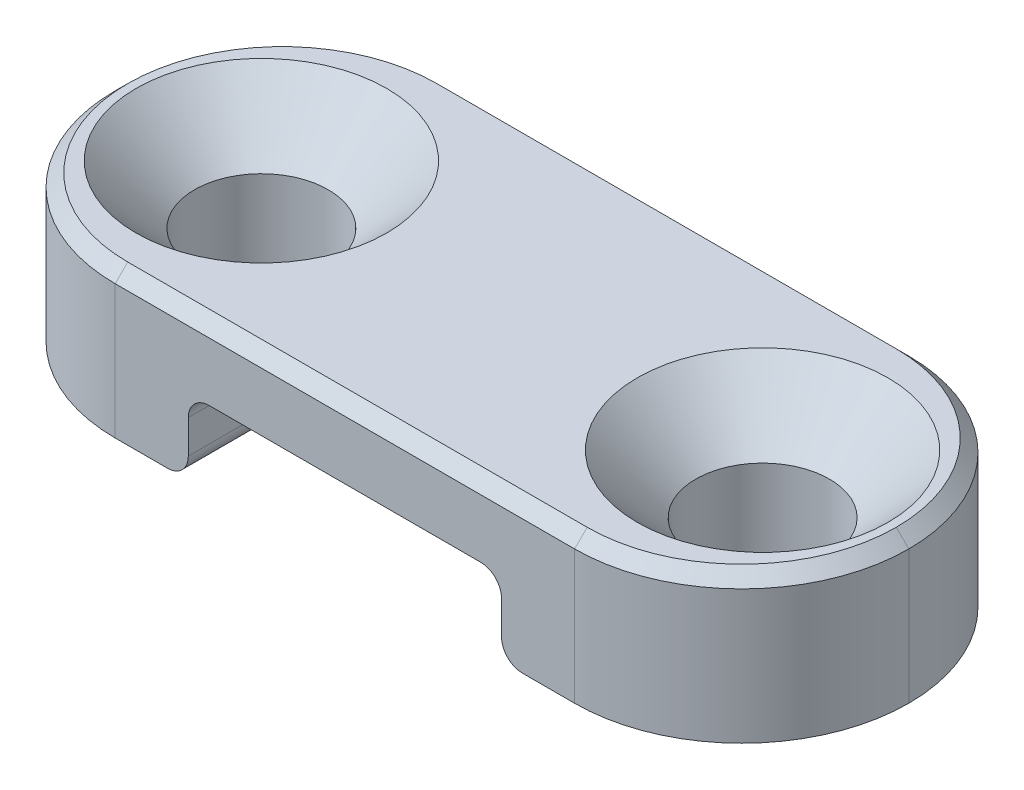
ISO-10303-21;
HEADER;
FILE_DESCRIPTION(('STEP AP214'),'2;1');
FILE_NAME('part.step','',(''),(''),'','','');
FILE_SCHEMA(('AUTOMOTIVE_DESIGN { 1 0 10303 214 1 1 1 1 }'));
ENDSEC;
DATA;
#1=APPLICATION_CONTEXT('core data for automotive mechanical design processes');
#2=APPLICATION_PROTOCOL_DEFINITION('international standard','automotive_design',2000,#1);
#3=PRODUCT_CONTEXT('',#1,'mechanical');
#4=PRODUCT('Part','Part','',(#3));
#5=PRODUCT_RELATED_PRODUCT_CATEGORY('part','',(#4));
#6=PRODUCT_DEFINITION_FORMATION('','',#4);
#7=PRODUCT_DEFINITION_CONTEXT('part definition',#1,'design');
#8=PRODUCT_DEFINITION('design','',#6,#7);
#9=PRODUCT_DEFINITION_SHAPE('','',#8);
#10=(LENGTH_UNIT() NAMED_UNIT(*) SI_UNIT(.MILLI.,.METRE.));
#11=(NAMED_UNIT(*) PLANE_ANGLE_UNIT() SI_UNIT($,.RADIAN.));
#12=(NAMED_UNIT(*) SI_UNIT($,.STERADIAN.) SOLID_ANGLE_UNIT());
#13=UNCERTAINTY_MEASURE_WITH_UNIT(LENGTH_MEASURE(1.E-05),#10,'distance_accuracy_value','');
#14=(GEOMETRIC_REPRESENTATION_CONTEXT(3) GLOBAL_UNCERTAINTY_ASSIGNED_CONTEXT((#13)) GLOBAL_UNIT_ASSIGNED_CONTEXT((#10,
#11,#12)) REPRESENTATION_CONTEXT('',''));
#15=CARTESIAN_POINT('',(0.,0.,0.));
#16=DIRECTION('',(0.,0.,1.));
#17=DIRECTION('',(1.,0.,0.));
#18=AXIS2_PLACEMENT_3D('',#15,#16,#17);
#19=CARTESIAN_POINT('',(0.,-1.75,0.));
#20=DIRECTION('',(0.,-1.,0.));
#21=DIRECTION('',(0.,0.,-1.));
#22=AXIS2_PLACEMENT_3D('',#19,#20,#21);
#23=PLANE('',#22);
#24=CARTESIAN_POINT('',(6.,-1.75,0.));
#25=DIRECTION('',(0.,1.,0.));
#26=DIRECTION('',(0.,0.,1.));
#27=AXIS2_PLACEMENT_3D('',#24,#25,#26);
#28=CIRCLE('',#27,1.6);
#29=CARTESIAN_POINT('',(6.,-1.75,1.6));
#30=VERTEX_POINT('',#29);
#31=EDGE_CURVE('E389',#30,#30,#28,.T.);
#32=ORIENTED_EDGE('',*,*,#31,.T.);
#33=EDGE_LOOP('',(#32));
#34=FACE_BOUND('',#33,.T.);
#35=DIRECTION('',(1.,0.,0.));
#36=VECTOR('',#35,1.);
#37=CARTESIAN_POINT('',(-9.5,-1.75,4.));
#38=LINE('',#37,#36);
#39=CARTESIAN_POINT('',(4.25,-1.75,4.));
#40=VERTEX_POINT('',#39);
#41=CARTESIAN_POINT('',(5.5,-1.75,4.));
#42=VERTEX_POINT('',#41);
#43=EDGE_CURVE('E186',#40,#42,#38,.T.);
#44=ORIENTED_EDGE('',*,*,#43,.F.);
#45=DIRECTION('',(0.,0.,1.));
#46=VECTOR('',#45,1.);
#47=CARTESIAN_POINT('',(4.25,-1.75,-4.));
#48=LINE('',#47,#46);
#49=CARTESIAN_POINT('',(4.25,-1.75,-4.));
#50=VERTEX_POINT('',#49);
#51=EDGE_CURVE('E184',#40,#50,#48,.F.);
#52=ORIENTED_EDGE('',*,*,#51,.T.);
#53=DIRECTION('',(-1.,0.,0.));
#54=VECTOR('',#53,1.);
#55=CARTESIAN_POINT('',(-9.5,-1.75,-4.));
#56=LINE('',#55,#54);
#57=CARTESIAN_POINT('',(5.5,-1.75,-4.));
#58=VERTEX_POINT('',#57);
#59=EDGE_CURVE('E170',#58,#50,#56,.T.);
#60=ORIENTED_EDGE('',*,*,#59,.F.);
#61=CARTESIAN_POINT('',(5.5,-1.75,0.));
#62=DIRECTION('',(0.,-1.,0.));
#63=DIRECTION('',(0.,0.,-1.));
#64=AXIS2_PLACEMENT_3D('',#61,#62,#63);
#65=CIRCLE('',#64,4.);
#66=CARTESIAN_POINT('',(9.5,-1.75,0.));
#67=VERTEX_POINT('',#66);
#68=EDGE_CURVE('E182',#58,#67,#65,.T.);
#69=ORIENTED_EDGE('',*,*,#68,.T.);
#70=CARTESIAN_POINT('',(5.5,-1.75,0.));
#71=DIRECTION('',(0.,-1.,0.));
#72=DIRECTION('',(0.,0.,-1.));
#73=AXIS2_PLACEMENT_3D('',#70,#71,#72);
#74=CIRCLE('',#73,4.);
#75=EDGE_CURVE('E193',#67,#42,#74,.T.);
#76=ORIENTED_EDGE('',*,*,#75,.T.);
#77=EDGE_LOOP('',(#44,#52,#60,#69,#76));
#78=FACE_BOUND('',#77,.T.);
#79=ADVANCED_FACE('F44',(#34,#78),#23,.T.);
#80=CARTESIAN_POINT('',(-9.5,1.75,-4.));
#81=DIRECTION('',(0.,0.,1.));
#82=DIRECTION('',(1.,0.,0.));
#83=AXIS2_PLACEMENT_3D('',#80,#81,#82);
#84=PLANE('',#83);
#85=DIRECTION('',(0.,-1.,0.));
#86=VECTOR('',#85,1.);
#87=CARTESIAN_POINT('',(-5.5,1.75,-4.));
#88=LINE('',#87,#86);
#89=CARTESIAN_POINT('',(-5.5,-1.75,-4.));
#90=VERTEX_POINT('',#89);
#91=CARTESIAN_POINT('',(-5.5,1.45,-4.));
#92=VERTEX_POINT('',#91);
#93=EDGE_CURVE('E176',#90,#92,#88,.F.);
#94=ORIENTED_EDGE('',*,*,#93,.T.);
#95=DIRECTION('',(1.,0.,0.));
#96=VECTOR('',#95,1.);
#97=CARTESIAN_POINT('',(-9.5,1.45,-4.));
#98=LINE('',#97,#96);
#99=CARTESIAN_POINT('',(5.5,1.45,-4.));
#100=VERTEX_POINT('',#99);
#101=EDGE_CURVE('E173',#92,#100,#98,.T.);
#102=ORIENTED_EDGE('',*,*,#101,.T.);
#103=DIRECTION('',(0.,-1.,0.));
#104=VECTOR('',#103,1.);
#105=CARTESIAN_POINT('',(5.5,1.75,-4.));
#106=LINE('',#105,#104);
#107=EDGE_CURVE('E166',#100,#58,#106,.T.);
#108=ORIENTED_EDGE('',*,*,#107,.T.);
#109=ORIENTED_EDGE('',*,*,#59,.T.);
#110=CARTESIAN_POINT('',(4.25,-1.25,-4.));
#111=DIRECTION('',(0.,0.,1.));
#112=DIRECTION('',(1.,0.,0.));
#113=AXIS2_PLACEMENT_3D('',#110,#111,#112);
#114=CIRCLE('',#113,0.5);
#115=CARTESIAN_POINT('',(3.75,-1.25,-4.));
#116=VERTEX_POINT('',#115);
#117=EDGE_CURVE('E242',#50,#116,#114,.F.);
#118=ORIENTED_EDGE('',*,*,#117,.T.);
#119=DIRECTION('',(0.,-1.,0.));
#120=VECTOR('',#119,1.);
#121=CARTESIAN_POINT('',(3.75,-1.75,-4.));
#122=LINE('',#121,#120);
#123=CARTESIAN_POINT('',(3.75,-0.45,-4.));
#124=VERTEX_POINT('',#123);
#125=EDGE_CURVE('E383',#124,#116,#122,.T.);
#126=ORIENTED_EDGE('',*,*,#125,.F.);
#127=CARTESIAN_POINT('',(3.25,-0.45,-4.));
#128=DIRECTION('',(0.,0.,1.));
#129=DIRECTION('',(1.,0.,0.));
#130=AXIS2_PLACEMENT_3D('',#127,#128,#129);
#131=CIRCLE('',#130,0.5);
#132=CARTESIAN_POINT('',(3.25,0.0499999999999999,-4.));
#133=VERTEX_POINT('',#132);
#134=EDGE_CURVE('E267',#124,#133,#131,.T.);
#135=ORIENTED_EDGE('',*,*,#134,.T.);
#136=DIRECTION('',(1.,0.,0.));
#137=VECTOR('',#136,1.);
#138=CARTESIAN_POINT('',(-3.75,0.0499999999999999,-4.));
#139=LINE('',#138,#137);
#140=CARTESIAN_POINT('',(-3.25,0.0499999999999999,-4.));
#141=VERTEX_POINT('',#140);
#142=EDGE_CURVE('E365',#141,#133,#139,.T.);
#143=ORIENTED_EDGE('',*,*,#142,.F.);
#144=CARTESIAN_POINT('',(-3.25,-0.45,-4.));
#145=DIRECTION('',(0.,0.,1.));
#146=DIRECTION('',(1.,0.,0.));
#147=AXIS2_PLACEMENT_3D('',#144,#145,#146);
#148=CIRCLE('',#147,0.5);
#149=CARTESIAN_POINT('',(-3.75,-0.45,-4.));
#150=VERTEX_POINT('',#149);
#151=EDGE_CURVE('E273',#141,#150,#148,.T.);
#152=ORIENTED_EDGE('',*,*,#151,.T.);
#153=DIRECTION('',(0.,1.,0.));
#154=VECTOR('',#153,1.);
#155=CARTESIAN_POINT('',(-3.75,-1.75,-4.));
#156=LINE('',#155,#154);
#157=CARTESIAN_POINT('',(-3.75,-1.25,-4.));
#158=VERTEX_POINT('',#157);
#159=EDGE_CURVE('E370',#158,#150,#156,.T.);
#160=ORIENTED_EDGE('',*,*,#159,.F.);
#161=CARTESIAN_POINT('',(-4.25,-1.25,-4.));
#162=DIRECTION('',(0.,0.,1.));
#163=DIRECTION('',(1.,0.,0.));
#164=AXIS2_PLACEMENT_3D('',#161,#162,#163);
#165=CIRCLE('',#164,0.5);
#166=CARTESIAN_POINT('',(-4.25,-1.75,-4.));
#167=VERTEX_POINT('',#166);
#168=EDGE_CURVE('E245',#158,#167,#165,.F.);
#169=ORIENTED_EDGE('',*,*,#168,.T.);
#170=EDGE_CURVE('E187',#167,#90,#56,.T.);
#171=ORIENTED_EDGE('',*,*,#170,.T.);
#172=EDGE_LOOP('',(#94,#102,#108,#109,#118,#126,#135,#143,#152,#160,#169,#171));
#173=FACE_BOUND('',#172,.T.);
#174=ADVANCED_FACE('F169',(#173),#84,.F.);
#175=CARTESIAN_POINT('',(-9.5,1.75,4.));
#176=DIRECTION('',(0.,0.,-1.));
#177=DIRECTION('',(-1.,0.,0.));
#178=AXIS2_PLACEMENT_3D('',#175,#176,#177);
#179=PLANE('',#178);
#180=DIRECTION('',(0.,-1.,0.));
#181=VECTOR('',#180,1.);
#182=CARTESIAN_POINT('',(5.5,1.75,4.));
#183=LINE('',#182,#181);
#184=CARTESIAN_POINT('',(5.5,1.45,4.));
#185=VERTEX_POINT('',#184);
#186=EDGE_CURVE('E207',#42,#185,#183,.F.);
#187=ORIENTED_EDGE('',*,*,#186,.T.);
#188=DIRECTION('',(-1.,0.,0.));
#189=VECTOR('',#188,1.);
#190=CARTESIAN_POINT('',(-9.5,1.45,4.));
#191=LINE('',#190,#189);
#192=CARTESIAN_POINT('',(-5.5,1.45,4.));
#193=VERTEX_POINT('',#192);
#194=EDGE_CURVE('E304',#185,#193,#191,.T.);
#195=ORIENTED_EDGE('',*,*,#194,.T.);
#196=DIRECTION('',(0.,-1.,0.));
#197=VECTOR('',#196,1.);
#198=CARTESIAN_POINT('',(-5.5,1.75,4.));
#199=LINE('',#198,#197);
#200=CARTESIAN_POINT('',(-5.5,-1.75,4.));
#201=VERTEX_POINT('',#200);
#202=EDGE_CURVE('E199',#193,#201,#199,.T.);
#203=ORIENTED_EDGE('',*,*,#202,.T.);
#204=CARTESIAN_POINT('',(-4.25,-1.75,4.));
#205=VERTEX_POINT('',#204);
#206=EDGE_CURVE('E194',#201,#205,#38,.T.);
#207=ORIENTED_EDGE('',*,*,#206,.T.);
#208=CARTESIAN_POINT('',(-4.25,-1.25,4.));
#209=DIRECTION('',(0.,0.,-1.));
#210=DIRECTION('',(-1.,0.,0.));
#211=AXIS2_PLACEMENT_3D('',#208,#209,#210);
#212=CIRCLE('',#211,0.5);
#213=CARTESIAN_POINT('',(-3.75,-1.25,4.));
#214=VERTEX_POINT('',#213);
#215=EDGE_CURVE('E232',#205,#214,#212,.F.);
#216=ORIENTED_EDGE('',*,*,#215,.T.);
#217=DIRECTION('',(0.,-1.,0.));
#218=VECTOR('',#217,1.);
#219=CARTESIAN_POINT('',(-3.75,-1.75,4.));
#220=LINE('',#219,#218);
#221=CARTESIAN_POINT('',(-3.75,-0.45,4.));
#222=VERTEX_POINT('',#221);
#223=EDGE_CURVE('E356',#222,#214,#220,.T.);
#224=ORIENTED_EDGE('',*,*,#223,.F.);
#225=CARTESIAN_POINT('',(-3.25,-0.45,4.));
#226=DIRECTION('',(0.,0.,-1.));
#227=DIRECTION('',(-1.,0.,0.));
#228=AXIS2_PLACEMENT_3D('',#225,#226,#227);
#229=CIRCLE('',#228,0.5);
#230=CARTESIAN_POINT('',(-3.25,0.0499999999999999,4.));
#231=VERTEX_POINT('',#230);
#232=EDGE_CURVE('E270',#222,#231,#229,.T.);
#233=ORIENTED_EDGE('',*,*,#232,.T.);
#234=DIRECTION('',(-1.,0.,0.));
#235=VECTOR('',#234,1.);
#236=CARTESIAN_POINT('',(-3.75,0.0499999999999999,4.));
#237=LINE('',#236,#235);
#238=CARTESIAN_POINT('',(3.25,0.0499999999999999,4.));
#239=VERTEX_POINT('',#238);
#240=EDGE_CURVE('E366',#239,#231,#237,.T.);
#241=ORIENTED_EDGE('',*,*,#240,.F.);
#242=CARTESIAN_POINT('',(3.25,-0.45,4.));
#243=DIRECTION('',(0.,0.,-1.));
#244=DIRECTION('',(-1.,0.,0.));
#245=AXIS2_PLACEMENT_3D('',#242,#243,#244);
#246=CIRCLE('',#245,0.5);
#247=CARTESIAN_POINT('',(3.75,-0.45,4.));
#248=VERTEX_POINT('',#247);
#249=EDGE_CURVE('E264',#239,#248,#246,.T.);
#250=ORIENTED_EDGE('',*,*,#249,.T.);
#251=DIRECTION('',(0.,1.,0.));
#252=VECTOR('',#251,1.);
#253=CARTESIAN_POINT('',(3.75,-1.75,4.));
#254=LINE('',#253,#252);
#255=CARTESIAN_POINT('',(3.75,-1.25,4.));
#256=VERTEX_POINT('',#255);
#257=EDGE_CURVE('E379',#256,#248,#254,.T.);
#258=ORIENTED_EDGE('',*,*,#257,.F.);
#259=CARTESIAN_POINT('',(4.25,-1.25,4.));
#260=DIRECTION('',(0.,0.,-1.));
#261=DIRECTION('',(-1.,0.,0.));
#262=AXIS2_PLACEMENT_3D('',#259,#260,#261);
#263=CIRCLE('',#262,0.5);
#264=EDGE_CURVE('E229',#256,#40,#263,.F.);
#265=ORIENTED_EDGE('',*,*,#264,.T.);
#266=ORIENTED_EDGE('',*,*,#43,.T.);
#267=EDGE_LOOP('',(#187,#195,#203,#207,#216,#224,#233,#241,#250,#258,#265,#266));
#268=FACE_BOUND('',#267,.T.);
#269=ADVANCED_FACE('F342',(#268),#179,.F.);
#270=CARTESIAN_POINT('',(0.,1.75,0.));
#271=DIRECTION('',(0.,-1.,0.));
#272=DIRECTION('',(0.,0.,-1.));
#273=AXIS2_PLACEMENT_3D('',#270,#271,#272);
#274=PLANE('',#273);
#275=DIRECTION('',(-1.,0.,0.));
#276=VECTOR('',#275,1.);
#277=CARTESIAN_POINT('',(0.,1.75,-3.7));
#278=LINE('',#277,#276);
#279=CARTESIAN_POINT('',(5.5,1.75,-3.7));
#280=VERTEX_POINT('',#279);
#281=CARTESIAN_POINT('',(-5.5,1.75,-3.7));
#282=VERTEX_POINT('',#281);
#283=EDGE_CURVE('E285',#280,#282,#278,.T.);
#284=ORIENTED_EDGE('',*,*,#283,.T.);
#285=CARTESIAN_POINT('',(-5.5,1.75,0.));
#286=DIRECTION('',(0.,-1.,0.));
#287=DIRECTION('',(0.,0.,-1.));
#288=AXIS2_PLACEMENT_3D('',#285,#286,#287);
#289=CIRCLE('',#288,3.7);
#290=CARTESIAN_POINT('',(-9.2,1.75,0.));
#291=VERTEX_POINT('',#290);
#292=EDGE_CURVE('E291',#282,#291,#289,.F.);
#293=ORIENTED_EDGE('',*,*,#292,.T.);
#294=CARTESIAN_POINT('',(-5.5,1.75,0.));
#295=DIRECTION('',(0.,-1.,0.));
#296=DIRECTION('',(0.,0.,-1.));
#297=AXIS2_PLACEMENT_3D('',#294,#295,#296);
#298=CIRCLE('',#297,3.7);
#299=CARTESIAN_POINT('',(-5.5,1.75,3.7));
#300=VERTEX_POINT('',#299);
#301=EDGE_CURVE('E288',#291,#300,#298,.F.);
#302=ORIENTED_EDGE('',*,*,#301,.T.);
#303=DIRECTION('',(1.,0.,0.));
#304=VECTOR('',#303,1.);
#305=CARTESIAN_POINT('',(0.,1.75,3.7));
#306=LINE('',#305,#304);
#307=CARTESIAN_POINT('',(5.5,1.75,3.7));
#308=VERTEX_POINT('',#307);
#309=EDGE_CURVE('E282',#300,#308,#306,.T.);
#310=ORIENTED_EDGE('',*,*,#309,.T.);
#311=CARTESIAN_POINT('',(5.5,1.75,0.));
#312=DIRECTION('',(0.,-1.,0.));
#313=DIRECTION('',(0.,0.,-1.));
#314=AXIS2_PLACEMENT_3D('',#311,#312,#313);
#315=CIRCLE('',#314,3.7);
#316=CARTESIAN_POINT('',(9.2,1.75,0.));
#317=VERTEX_POINT('',#316);
#318=EDGE_CURVE('E276',#308,#317,#315,.F.);
#319=ORIENTED_EDGE('',*,*,#318,.T.);
#320=CARTESIAN_POINT('',(5.5,1.75,0.));
#321=DIRECTION('',(0.,-1.,0.));
#322=DIRECTION('',(0.,0.,-1.));
#323=AXIS2_PLACEMENT_3D('',#320,#321,#322);
#324=CIRCLE('',#323,3.7);
#325=EDGE_CURVE('E279',#317,#280,#324,.F.);
#326=ORIENTED_EDGE('',*,*,#325,.T.);
#327=EDGE_LOOP('',(#284,#293,#302,#310,#319,#326));
#328=FACE_BOUND('',#327,.T.);
#329=CARTESIAN_POINT('',(-6.,1.75,0.));
#330=DIRECTION('',(0.,1.,0.));
#331=DIRECTION('',(0.,0.,1.));
#332=AXIS2_PLACEMENT_3D('',#329,#330,#331);
#333=CIRCLE('',#332,3.);
#334=CARTESIAN_POINT('',(-6.,1.75,3.));
#335=VERTEX_POINT('',#334);
#336=EDGE_CURVE('E221',#335,#335,#333,.T.);
#337=ORIENTED_EDGE('',*,*,#336,.F.);
#338=EDGE_LOOP('',(#337));
#339=FACE_BOUND('',#338,.T.);
#340=CARTESIAN_POINT('',(6.,1.75,0.));
#341=DIRECTION('',(0.,1.,0.));
#342=DIRECTION('',(0.,0.,1.));
#343=AXIS2_PLACEMENT_3D('',#340,#341,#342);
#344=CIRCLE('',#343,3.);
#345=CARTESIAN_POINT('',(6.,1.75,3.));
#346=VERTEX_POINT('',#345);
#347=EDGE_CURVE('E397',#346,#346,#344,.T.);
#348=ORIENTED_EDGE('',*,*,#347,.F.);
#349=EDGE_LOOP('',(#348));
#350=FACE_BOUND('',#349,.T.);
#351=ADVANCED_FACE('F414',(#328,#339,#350),#274,.F.);
#352=CARTESIAN_POINT('',(-6.,-1.75,0.));
#353=DIRECTION('',(0.,1.,0.));
#354=DIRECTION('',(0.,0.,1.));
#355=AXIS2_PLACEMENT_3D('',#352,#353,#354);
#356=CIRCLE('',#355,1.6);
#357=CARTESIAN_POINT('',(-6.,-1.75,1.6));
#358=VERTEX_POINT('',#357);
#359=EDGE_CURVE('E401',#358,#358,#356,.T.);
#360=ORIENTED_EDGE('',*,*,#359,.T.);
#361=EDGE_LOOP('',(#360));
#362=FACE_BOUND('',#361,.T.);
#363=ORIENTED_EDGE('',*,*,#170,.F.);
#364=DIRECTION('',(0.,0.,1.));
#365=VECTOR('',#364,1.);
#366=CARTESIAN_POINT('',(-4.25,-1.75,4.));
#367=LINE('',#366,#365);
#368=EDGE_CURVE('E218',#167,#205,#367,.T.);
#369=ORIENTED_EDGE('',*,*,#368,.T.);
#370=ORIENTED_EDGE('',*,*,#206,.F.);
#371=CARTESIAN_POINT('',(-5.5,-1.75,0.));
#372=DIRECTION('',(0.,-1.,0.));
#373=DIRECTION('',(0.,0.,-1.));
#374=AXIS2_PLACEMENT_3D('',#371,#372,#373);
#375=CIRCLE('',#374,4.);
#376=CARTESIAN_POINT('',(-9.5,-1.75,0.));
#377=VERTEX_POINT('',#376);
#378=EDGE_CURVE('E210',#201,#377,#375,.T.);
#379=ORIENTED_EDGE('',*,*,#378,.T.);
#380=CARTESIAN_POINT('',(-5.5,-1.75,0.));
#381=DIRECTION('',(0.,-1.,0.));
#382=DIRECTION('',(0.,0.,-1.));
#383=AXIS2_PLACEMENT_3D('',#380,#381,#382);
#384=CIRCLE('',#383,4.);
#385=EDGE_CURVE('E177',#377,#90,#384,.T.);
#386=ORIENTED_EDGE('',*,*,#385,.T.);
#387=EDGE_LOOP('',(#363,#369,#370,#379,#386));
#388=FACE_BOUND('',#387,.T.);
#389=ADVANCED_FACE('F351',(#362,#388),#23,.T.);
#390=CARTESIAN_POINT('',(3.75,-1.75,-4.001));
#391=DIRECTION('',(1.,0.,0.));
#392=DIRECTION('',(0.,0.,-1.));
#393=AXIS2_PLACEMENT_3D('',#390,#391,#392);
#394=PLANE('',#393);
#395=ORIENTED_EDGE('',*,*,#125,.T.);
#396=DIRECTION('',(0.,0.,1.));
#397=VECTOR('',#396,1.);
#398=CARTESIAN_POINT('',(3.75,-1.25,4.));
#399=LINE('',#398,#397);
#400=EDGE_CURVE('E251',#116,#256,#399,.T.);
#401=ORIENTED_EDGE('',*,*,#400,.T.);
#402=ORIENTED_EDGE('',*,*,#257,.T.);
#403=DIRECTION('',(0.,0.,1.));
#404=VECTOR('',#403,1.);
#405=CARTESIAN_POINT('',(3.75,-0.45,-4.));
#406=LINE('',#405,#404);
#407=EDGE_CURVE('E248',#248,#124,#406,.F.);
#408=ORIENTED_EDGE('',*,*,#407,.T.);
#409=EDGE_LOOP('',(#395,#401,#402,#408));
#410=FACE_BOUND('',#409,.T.);
#411=ADVANCED_FACE('F446',(#410),#394,.F.);
#412=CARTESIAN_POINT('',(-3.75,-1.75,-4.001));
#413=DIRECTION('',(-1.,0.,0.));
#414=DIRECTION('',(0.,0.,1.));
#415=AXIS2_PLACEMENT_3D('',#412,#413,#414);
#416=PLANE('',#415);
#417=ORIENTED_EDGE('',*,*,#223,.T.);
#418=DIRECTION('',(0.,0.,1.));
#419=VECTOR('',#418,1.);
#420=CARTESIAN_POINT('',(-3.75,-1.25,-4.));
#421=LINE('',#420,#419);
#422=EDGE_CURVE('E239',#214,#158,#421,.F.);
#423=ORIENTED_EDGE('',*,*,#422,.T.);
#424=ORIENTED_EDGE('',*,*,#159,.T.);
#425=DIRECTION('',(0.,0.,1.));
#426=VECTOR('',#425,1.);
#427=CARTESIAN_POINT('',(-3.75,-0.45,4.));
#428=LINE('',#427,#426);
#429=EDGE_CURVE('E235',#150,#222,#428,.T.);
#430=ORIENTED_EDGE('',*,*,#429,.T.);
#431=EDGE_LOOP('',(#417,#423,#424,#430));
#432=FACE_BOUND('',#431,.T.);
#433=ADVANCED_FACE('F360',(#432),#416,.F.);
#434=CARTESIAN_POINT('',(-3.75,0.0499999999999999,-4.001));
#435=DIRECTION('',(0.,1.,0.));
#436=DIRECTION('',(0.,0.,1.));
#437=AXIS2_PLACEMENT_3D('',#434,#435,#436);
#438=PLANE('',#437);
#439=ORIENTED_EDGE('',*,*,#142,.T.);
#440=DIRECTION('',(0.,0.,1.));
#441=VECTOR('',#440,1.);
#442=CARTESIAN_POINT('',(3.25,0.0499999999999999,4.));
#443=LINE('',#442,#441);
#444=EDGE_CURVE('E260',#133,#239,#443,.T.);
#445=ORIENTED_EDGE('',*,*,#444,.T.);
#446=ORIENTED_EDGE('',*,*,#240,.T.);
#447=DIRECTION('',(0.,0.,1.));
#448=VECTOR('',#447,1.);
#449=CARTESIAN_POINT('',(-3.25,0.0499999999999999,-4.));
#450=LINE('',#449,#448);
#451=EDGE_CURVE('E257',#231,#141,#450,.F.);
#452=ORIENTED_EDGE('',*,*,#451,.T.);
#453=EDGE_LOOP('',(#439,#445,#446,#452));
#454=FACE_BOUND('',#453,.T.);
#455=ADVANCED_FACE('F433',(#454),#438,.F.);
#456=CARTESIAN_POINT('',(6.,1.75,0.));
#457=DIRECTION('',(0.,1.,0.));
#458=DIRECTION('',(0.,0.,1.));
#459=AXIS2_PLACEMENT_3D('',#456,#457,#458);
#460=CYLINDRICAL_SURFACE('',#459,1.6);
#461=ORIENTED_EDGE('',*,*,#31,.F.);
#462=EDGE_LOOP('',(#461));
#463=FACE_BOUND('',#462,.T.);
#464=CARTESIAN_POINT('',(6.,0.35,0.));
#465=DIRECTION('',(0.,1.,0.));
#466=DIRECTION('',(0.,0.,1.));
#467=AXIS2_PLACEMENT_3D('',#464,#465,#466);
#468=CIRCLE('',#467,1.6);
#469=CARTESIAN_POINT('',(6.,0.35,1.6));
#470=VERTEX_POINT('',#469);
#471=EDGE_CURVE('E393',#470,#470,#468,.T.);
#472=ORIENTED_EDGE('',*,*,#471,.T.);
#473=EDGE_LOOP('',(#472));
#474=FACE_BOUND('',#473,.T.);
#475=ADVANCED_FACE('F424',(#463,#474),#460,.F.);
#476=CARTESIAN_POINT('',(6.,1.75,0.));
#477=DIRECTION('',(0.,1.,0.));
#478=DIRECTION('',(0.,0.,1.));
#479=AXIS2_PLACEMENT_3D('',#476,#477,#478);
#480=CONICAL_SURFACE('',#479,3.,0.785398163397449);
#481=ORIENTED_EDGE('',*,*,#471,.F.);
#482=EDGE_LOOP('',(#481));
#483=FACE_BOUND('',#482,.T.);
#484=ORIENTED_EDGE('',*,*,#347,.T.);
#485=EDGE_LOOP('',(#484));
#486=FACE_BOUND('',#485,.T.);
#487=ADVANCED_FACE('F421',(#483,#486),#480,.F.);
#488=CARTESIAN_POINT('',(-6.,1.75,0.));
#489=DIRECTION('',(0.,1.,0.));
#490=DIRECTION('',(0.,0.,1.));
#491=AXIS2_PLACEMENT_3D('',#488,#489,#490);
#492=CYLINDRICAL_SURFACE('',#491,1.6);
#493=ORIENTED_EDGE('',*,*,#359,.F.);
#494=EDGE_LOOP('',(#493));
#495=FACE_BOUND('',#494,.T.);
#496=CARTESIAN_POINT('',(-6.,0.35,0.));
#497=DIRECTION('',(0.,1.,0.));
#498=DIRECTION('',(0.,0.,1.));
#499=AXIS2_PLACEMENT_3D('',#496,#497,#498);
#500=CIRCLE('',#499,1.6);
#501=CARTESIAN_POINT('',(-6.,0.35,1.6));
#502=VERTEX_POINT('',#501);
#503=EDGE_CURVE('E405',#502,#502,#500,.T.);
#504=ORIENTED_EDGE('',*,*,#503,.T.);
#505=EDGE_LOOP('',(#504));
#506=FACE_BOUND('',#505,.T.);
#507=ADVANCED_FACE('F423',(#495,#506),#492,.F.);
#508=CARTESIAN_POINT('',(-6.,1.75,0.));
#509=DIRECTION('',(0.,1.,0.));
#510=DIRECTION('',(0.,0.,1.));
#511=AXIS2_PLACEMENT_3D('',#508,#509,#510);
#512=CONICAL_SURFACE('',#511,3.,0.785398163397449);
#513=ORIENTED_EDGE('',*,*,#503,.F.);
#514=EDGE_LOOP('',(#513));
#515=FACE_BOUND('',#514,.T.);
#516=ORIENTED_EDGE('',*,*,#336,.T.);
#517=EDGE_LOOP('',(#516));
#518=FACE_BOUND('',#517,.T.);
#519=ADVANCED_FACE('F412',(#515,#518),#512,.F.);
#520=CARTESIAN_POINT('',(5.5,1.75,0.));
#521=DIRECTION('',(0.,-1.,0.));
#522=DIRECTION('',(0.,0.,-1.));
#523=AXIS2_PLACEMENT_3D('',#520,#521,#522);
#524=CYLINDRICAL_SURFACE('',#523,4.);
#525=ORIENTED_EDGE('',*,*,#107,.F.);
#526=CARTESIAN_POINT('',(5.5,1.45,0.));
#527=DIRECTION('',(0.,-1.,0.));
#528=DIRECTION('',(0.,0.,-1.));
#529=AXIS2_PLACEMENT_3D('',#526,#527,#528);
#530=CIRCLE('',#529,4.);
#531=CARTESIAN_POINT('',(9.5,1.45,0.));
#532=VERTEX_POINT('',#531);
#533=EDGE_CURVE('E55',#100,#532,#530,.T.);
#534=ORIENTED_EDGE('',*,*,#533,.T.);
#535=DIRECTION('',(0.,-1.,0.));
#536=VECTOR('',#535,1.);
#537=CARTESIAN_POINT('',(9.5,1.75,0.));
#538=LINE('',#537,#536);
#539=EDGE_CURVE('E190',#67,#532,#538,.F.);
#540=ORIENTED_EDGE('',*,*,#539,.F.);
#541=ORIENTED_EDGE('',*,*,#68,.F.);
#542=EDGE_LOOP('',(#525,#534,#540,#541));
#543=FACE_BOUND('',#542,.T.);
#544=ADVANCED_FACE('F189',(#543),#524,.T.);
#545=CARTESIAN_POINT('',(5.5,1.75,0.));
#546=DIRECTION('',(0.,-1.,0.));
#547=DIRECTION('',(0.,0.,-1.));
#548=AXIS2_PLACEMENT_3D('',#545,#546,#547);
#549=CYLINDRICAL_SURFACE('',#548,4.);
#550=ORIENTED_EDGE('',*,*,#539,.T.);
#551=CARTESIAN_POINT('',(5.5,1.45,0.));
#552=DIRECTION('',(0.,-1.,0.));
#553=DIRECTION('',(0.,0.,-1.));
#554=AXIS2_PLACEMENT_3D('',#551,#552,#553);
#555=CIRCLE('',#554,4.);
#556=EDGE_CURVE('E11',#532,#185,#555,.T.);
#557=ORIENTED_EDGE('',*,*,#556,.T.);
#558=ORIENTED_EDGE('',*,*,#186,.F.);
#559=ORIENTED_EDGE('',*,*,#75,.F.);
#560=EDGE_LOOP('',(#550,#557,#558,#559));
#561=FACE_BOUND('',#560,.T.);
#562=ADVANCED_FACE('F462',(#561),#549,.T.);
#563=CARTESIAN_POINT('',(-5.5,1.75,0.));
#564=DIRECTION('',(0.,-1.,0.));
#565=DIRECTION('',(0.,0.,-1.));
#566=AXIS2_PLACEMENT_3D('',#563,#564,#565);
#567=CYLINDRICAL_SURFACE('',#566,4.);
#568=ORIENTED_EDGE('',*,*,#202,.F.);
#569=CARTESIAN_POINT('',(-5.5,1.45,0.));
#570=DIRECTION('',(0.,-1.,0.));
#571=DIRECTION('',(0.,0.,-1.));
#572=AXIS2_PLACEMENT_3D('',#569,#570,#571);
#573=CIRCLE('',#572,4.);
#574=CARTESIAN_POINT('',(-9.5,1.45,0.));
#575=VERTEX_POINT('',#574);
#576=EDGE_CURVE('E299',#193,#575,#573,.T.);
#577=ORIENTED_EDGE('',*,*,#576,.T.);
#578=DIRECTION('',(0.,-1.,0.));
#579=VECTOR('',#578,1.);
#580=CARTESIAN_POINT('',(-9.5,1.75,0.));
#581=LINE('',#580,#579);
#582=EDGE_CURVE('E222',#377,#575,#581,.F.);
#583=ORIENTED_EDGE('',*,*,#582,.F.);
#584=ORIENTED_EDGE('',*,*,#378,.F.);
#585=EDGE_LOOP('',(#568,#577,#583,#584));
#586=FACE_BOUND('',#585,.T.);
#587=ADVANCED_FACE('F346',(#586),#567,.T.);
#588=CARTESIAN_POINT('',(-5.5,1.75,0.));
#589=DIRECTION('',(0.,-1.,0.));
#590=DIRECTION('',(0.,0.,-1.));
#591=AXIS2_PLACEMENT_3D('',#588,#589,#590);
#592=CYLINDRICAL_SURFACE('',#591,4.);
#593=ORIENTED_EDGE('',*,*,#582,.T.);
#594=CARTESIAN_POINT('',(-5.5,1.45,0.));
#595=DIRECTION('',(0.,-1.,0.));
#596=DIRECTION('',(0.,0.,-1.));
#597=AXIS2_PLACEMENT_3D('',#594,#595,#596);
#598=CIRCLE('',#597,4.);
#599=EDGE_CURVE('E295',#575,#92,#598,.T.);
#600=ORIENTED_EDGE('',*,*,#599,.T.);
#601=ORIENTED_EDGE('',*,*,#93,.F.);
#602=ORIENTED_EDGE('',*,*,#385,.F.);
#603=EDGE_LOOP('',(#593,#600,#601,#602));
#604=FACE_BOUND('',#603,.T.);
#605=ADVANCED_FACE('F469',(#604),#592,.T.);
#606=CARTESIAN_POINT('',(-4.25,-1.25,0.));
#607=DIRECTION('',(0.,0.,-1.));
#608=DIRECTION('',(-1.,0.,0.));
#609=AXIS2_PLACEMENT_3D('',#606,#607,#608);
#610=CYLINDRICAL_SURFACE('',#609,0.5);
#611=ORIENTED_EDGE('',*,*,#168,.F.);
#612=ORIENTED_EDGE('',*,*,#422,.F.);
#613=ORIENTED_EDGE('',*,*,#215,.F.);
#614=ORIENTED_EDGE('',*,*,#368,.F.);
#615=EDGE_LOOP('',(#611,#612,#613,#614));
#616=FACE_BOUND('',#615,.T.);
#617=ADVANCED_FACE('F369',(#616),#610,.T.);
#618=CARTESIAN_POINT('',(4.25,-1.25,-4.001));
#619=DIRECTION('',(0.,0.,-1.));
#620=DIRECTION('',(-1.,0.,0.));
#621=AXIS2_PLACEMENT_3D('',#618,#619,#620);
#622=CYLINDRICAL_SURFACE('',#621,0.5);
#623=ORIENTED_EDGE('',*,*,#117,.F.);
#624=ORIENTED_EDGE('',*,*,#51,.F.);
#625=ORIENTED_EDGE('',*,*,#264,.F.);
#626=ORIENTED_EDGE('',*,*,#400,.F.);
#627=EDGE_LOOP('',(#623,#624,#625,#626));
#628=FACE_BOUND('',#627,.T.);
#629=ADVANCED_FACE('F477',(#628),#622,.T.);
#630=CARTESIAN_POINT('',(3.25,-0.45,-4.001));
#631=DIRECTION('',(0.,0.,-1.));
#632=DIRECTION('',(-1.,0.,0.));
#633=AXIS2_PLACEMENT_3D('',#630,#631,#632);
#634=CYLINDRICAL_SURFACE('',#633,0.5);
#635=ORIENTED_EDGE('',*,*,#134,.F.);
#636=ORIENTED_EDGE('',*,*,#407,.F.);
#637=ORIENTED_EDGE('',*,*,#249,.F.);
#638=ORIENTED_EDGE('',*,*,#444,.F.);
#639=EDGE_LOOP('',(#635,#636,#637,#638));
#640=FACE_BOUND('',#639,.T.);
#641=ADVANCED_FACE('F480',(#640),#634,.F.);
#642=CARTESIAN_POINT('',(-3.25,-0.45,-4.001));
#643=DIRECTION('',(0.,0.,-1.));
#644=DIRECTION('',(-1.,0.,0.));
#645=AXIS2_PLACEMENT_3D('',#642,#643,#644);
#646=CYLINDRICAL_SURFACE('',#645,0.5);
#647=ORIENTED_EDGE('',*,*,#151,.F.);
#648=ORIENTED_EDGE('',*,*,#451,.F.);
#649=ORIENTED_EDGE('',*,*,#232,.F.);
#650=ORIENTED_EDGE('',*,*,#429,.F.);
#651=EDGE_LOOP('',(#647,#648,#649,#650));
#652=FACE_BOUND('',#651,.T.);
#653=ADVANCED_FACE('F484',(#652),#646,.F.);
#654=CARTESIAN_POINT('',(5.5,1.75,0.));
#655=DIRECTION('',(0.,-1.,0.));
#656=DIRECTION('',(0.,0.,-1.));
#657=AXIS2_PLACEMENT_3D('',#654,#655,#656);
#658=CONICAL_SURFACE('',#657,3.7,0.78539816339745);
#659=DIRECTION('',(0.,0.707106781186547,-0.707106781186549));
#660=VECTOR('',#659,1.);
#661=CARTESIAN_POINT('',(5.5,1.45,4.));
#662=LINE('',#661,#660);
#663=EDGE_CURVE('E321',#185,#308,#662,.T.);
#664=ORIENTED_EDGE('',*,*,#663,.F.);
#665=ORIENTED_EDGE('',*,*,#556,.F.);
#666=DIRECTION('',(0.707106781186549,-0.707106781186547,0.));
#667=VECTOR('',#666,1.);
#668=CARTESIAN_POINT('',(9.2,1.75,0.));
#669=LINE('',#668,#667);
#670=EDGE_CURVE('E49',#317,#532,#669,.T.);
#671=ORIENTED_EDGE('',*,*,#670,.F.);
#672=ORIENTED_EDGE('',*,*,#318,.F.);
#673=EDGE_LOOP('',(#664,#665,#671,#672));
#674=FACE_BOUND('',#673,.T.);
#675=ADVANCED_FACE('F47',(#674),#658,.T.);
#676=CARTESIAN_POINT('',(5.5,1.75,0.));
#677=DIRECTION('',(0.,-1.,0.));
#678=DIRECTION('',(0.,0.,-1.));
#679=AXIS2_PLACEMENT_3D('',#676,#677,#678);
#680=CONICAL_SURFACE('',#679,3.7,0.78539816339745);
#681=ORIENTED_EDGE('',*,*,#670,.T.);
#682=ORIENTED_EDGE('',*,*,#533,.F.);
#683=DIRECTION('',(0.,-0.707106781186547,-0.707106781186549));
#684=VECTOR('',#683,1.);
#685=CARTESIAN_POINT('',(5.5,1.75,-3.7));
#686=LINE('',#685,#684);
#687=EDGE_CURVE('E318',#280,#100,#686,.T.);
#688=ORIENTED_EDGE('',*,*,#687,.F.);
#689=ORIENTED_EDGE('',*,*,#325,.F.);
#690=EDGE_LOOP('',(#681,#682,#688,#689));
#691=FACE_BOUND('',#690,.T.);
#692=ADVANCED_FACE('F333',(#691),#680,.T.);
#693=CARTESIAN_POINT('',(0.,1.75,3.7));
#694=DIRECTION('',(0.,-0.707106781186549,-0.707106781186547));
#695=DIRECTION('',(1.,0.,0.));
#696=AXIS2_PLACEMENT_3D('',#693,#694,#695);
#697=PLANE('',#696);
#698=ORIENTED_EDGE('',*,*,#663,.T.);
#699=ORIENTED_EDGE('',*,*,#309,.F.);
#700=DIRECTION('',(0.,0.707106781186547,-0.707106781186549));
#701=VECTOR('',#700,1.);
#702=CARTESIAN_POINT('',(-5.5,1.45,4.));
#703=LINE('',#702,#701);
#704=EDGE_CURVE('E314',#193,#300,#703,.T.);
#705=ORIENTED_EDGE('',*,*,#704,.F.);
#706=ORIENTED_EDGE('',*,*,#194,.F.);
#707=EDGE_LOOP('',(#698,#699,#705,#706));
#708=FACE_BOUND('',#707,.T.);
#709=ADVANCED_FACE('F338',(#708),#697,.F.);
#710=CARTESIAN_POINT('',(0.,1.75,-3.7));
#711=DIRECTION('',(0.,-0.707106781186549,0.707106781186547));
#712=DIRECTION('',(-1.,0.,0.));
#713=AXIS2_PLACEMENT_3D('',#710,#711,#712);
#714=PLANE('',#713);
#715=ORIENTED_EDGE('',*,*,#687,.T.);
#716=ORIENTED_EDGE('',*,*,#101,.F.);
#717=DIRECTION('',(0.,-0.707106781186547,-0.707106781186549));
#718=VECTOR('',#717,1.);
#719=CARTESIAN_POINT('',(-5.5,1.75,-3.7));
#720=LINE('',#719,#718);
#721=EDGE_CURVE('E311',#282,#92,#720,.T.);
#722=ORIENTED_EDGE('',*,*,#721,.F.);
#723=ORIENTED_EDGE('',*,*,#283,.F.);
#724=EDGE_LOOP('',(#715,#716,#722,#723));
#725=FACE_BOUND('',#724,.T.);
#726=ADVANCED_FACE('F503',(#725),#714,.F.);
#727=CARTESIAN_POINT('',(-5.5,1.75,0.));
#728=DIRECTION('',(0.,-1.,0.));
#729=DIRECTION('',(0.,0.,-1.));
#730=AXIS2_PLACEMENT_3D('',#727,#728,#729);
#731=CONICAL_SURFACE('',#730,3.7,0.78539816339745);
#732=ORIENTED_EDGE('',*,*,#704,.T.);
#733=ORIENTED_EDGE('',*,*,#301,.F.);
#734=DIRECTION('',(0.707106781186549,0.707106781186547,0.));
#735=VECTOR('',#734,1.);
#736=CARTESIAN_POINT('',(-9.5,1.45,0.));
#737=LINE('',#736,#735);
#738=EDGE_CURVE('E308',#575,#291,#737,.T.);
#739=ORIENTED_EDGE('',*,*,#738,.F.);
#740=ORIENTED_EDGE('',*,*,#576,.F.);
#741=EDGE_LOOP('',(#732,#733,#739,#740));
#742=FACE_BOUND('',#741,.T.);
#743=ADVANCED_FACE('F496',(#742),#731,.T.);
#744=CARTESIAN_POINT('',(-5.5,1.75,0.));
#745=DIRECTION('',(0.,-1.,0.));
#746=DIRECTION('',(0.,0.,-1.));
#747=AXIS2_PLACEMENT_3D('',#744,#745,#746);
#748=CONICAL_SURFACE('',#747,3.7,0.78539816339745);
#749=ORIENTED_EDGE('',*,*,#721,.T.);
#750=ORIENTED_EDGE('',*,*,#599,.F.);
#751=ORIENTED_EDGE('',*,*,#738,.T.);
#752=ORIENTED_EDGE('',*,*,#292,.F.);
#753=EDGE_LOOP('',(#749,#750,#751,#752));
#754=FACE_BOUND('',#753,.T.);
#755=ADVANCED_FACE('F490',(#754),#748,.T.);
#756=CLOSED_SHELL('',(#79,#174,#269,#351,#389,#411,#433,#455,#475,#487,#507,#519,#544,#562,#587,
#605,#617,#629,#641,#653,#675,#692,#709,#726,#743,#755));
#757=MANIFOLD_SOLID_BREP('B2',#756);
#758=ADVANCED_BREP_SHAPE_REPRESENTATION('',(#18,#757),#14);
#759=SHAPE_DEFINITION_REPRESENTATION(#9,#758);
ENDSEC;
END-ISO-10303-21;
